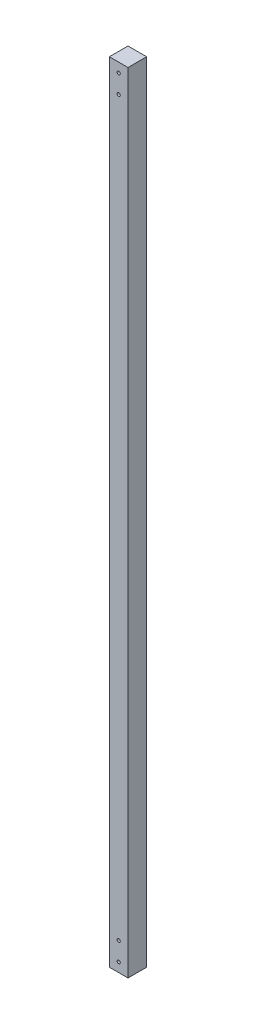
ISO-10303-21;
HEADER;
FILE_DESCRIPTION(('STEP AP214'),'2;1');
FILE_NAME('part.step','',(''),(''),'','','');
FILE_SCHEMA(('AUTOMOTIVE_DESIGN { 1 0 10303 214 1 1 1 1 }'));
ENDSEC;
DATA;
#1=APPLICATION_CONTEXT('core data for automotive mechanical design processes');
#2=APPLICATION_PROTOCOL_DEFINITION('international standard','automotive_design',2000,#1);
#3=PRODUCT_CONTEXT('',#1,'mechanical');
#4=PRODUCT('Part','Part','',(#3));
#5=PRODUCT_RELATED_PRODUCT_CATEGORY('part','',(#4));
#6=PRODUCT_DEFINITION_FORMATION('','',#4);
#7=PRODUCT_DEFINITION_CONTEXT('part definition',#1,'design');
#8=PRODUCT_DEFINITION('design','',#6,#7);
#9=PRODUCT_DEFINITION_SHAPE('','',#8);
#10=(LENGTH_UNIT() NAMED_UNIT(*) SI_UNIT(.MILLI.,.METRE.));
#11=(NAMED_UNIT(*) PLANE_ANGLE_UNIT() SI_UNIT($,.RADIAN.));
#12=(NAMED_UNIT(*) SI_UNIT($,.STERADIAN.) SOLID_ANGLE_UNIT());
#13=UNCERTAINTY_MEASURE_WITH_UNIT(LENGTH_MEASURE(1.E-05),#10,'distance_accuracy_value','');
#14=(GEOMETRIC_REPRESENTATION_CONTEXT(3) GLOBAL_UNCERTAINTY_ASSIGNED_CONTEXT((#13)) GLOBAL_UNIT_ASSIGNED_CONTEXT((#10,
#11,#12)) REPRESENTATION_CONTEXT('',''));
#15=CARTESIAN_POINT('',(0.,0.,0.));
#16=DIRECTION('',(0.,0.,1.));
#17=DIRECTION('',(1.,0.,0.));
#18=AXIS2_PLACEMENT_3D('',#15,#16,#17);
#19=CARTESIAN_POINT('',(0.,846.5,0.));
#20=DIRECTION('',(1.,0.,0.));
#21=DIRECTION('',(0.,0.,-1.));
#22=AXIS2_PLACEMENT_3D('',#19,#20,#21);
#23=PLANE('',#22);
#24=DIRECTION('',(0.,0.,1.));
#25=VECTOR('',#24,1.);
#26=CARTESIAN_POINT('',(0.,0.,0.));
#27=LINE('',#26,#25);
#28=CARTESIAN_POINT('',(0.,0.,-20.));
#29=VERTEX_POINT('',#28);
#30=CARTESIAN_POINT('',(0.,0.,0.));
#31=VERTEX_POINT('',#30);
#32=EDGE_CURVE('E120',#29,#31,#27,.T.);
#33=ORIENTED_EDGE('',*,*,#32,.T.);
#34=DIRECTION('',(0.,-1.,0.));
#35=VECTOR('',#34,1.);
#36=CARTESIAN_POINT('',(0.,846.5,0.));
#37=LINE('',#36,#35);
#38=CARTESIAN_POINT('',(0.,846.5,0.));
#39=VERTEX_POINT('',#38);
#40=EDGE_CURVE('E12',#39,#31,#37,.T.);
#41=ORIENTED_EDGE('',*,*,#40,.F.);
#42=DIRECTION('',(0.,0.,1.));
#43=VECTOR('',#42,1.);
#44=CARTESIAN_POINT('',(0.,846.5,0.));
#45=LINE('',#44,#43);
#46=CARTESIAN_POINT('',(0.,846.5,-20.));
#47=VERTEX_POINT('',#46);
#48=EDGE_CURVE('E99',#47,#39,#45,.T.);
#49=ORIENTED_EDGE('',*,*,#48,.F.);
#50=DIRECTION('',(0.,-1.,0.));
#51=VECTOR('',#50,1.);
#52=CARTESIAN_POINT('',(0.,846.5,-20.));
#53=LINE('',#52,#51);
#54=EDGE_CURVE('E115',#47,#29,#53,.T.);
#55=ORIENTED_EDGE('',*,*,#54,.T.);
#56=EDGE_LOOP('',(#33,#41,#49,#55));
#57=FACE_BOUND('',#56,.T.);
#58=ADVANCED_FACE('F50',(#57),#23,.F.);
#59=CARTESIAN_POINT('',(0.,846.5,0.));
#60=DIRECTION('',(0.,0.,-1.));
#61=DIRECTION('',(-1.,0.,0.));
#62=AXIS2_PLACEMENT_3D('',#59,#60,#61);
#63=PLANE('',#62);
#64=CARTESIAN_POINT('',(10.,10.,0.));
#65=DIRECTION('',(0.,0.,1.));
#66=DIRECTION('',(1.,0.,0.));
#67=AXIS2_PLACEMENT_3D('',#64,#65,#66);
#68=CIRCLE('',#67,1.7);
#69=CARTESIAN_POINT('',(11.7,10.,0.));
#70=VERTEX_POINT('',#69);
#71=EDGE_CURVE('E142',#70,#70,#68,.T.);
#72=ORIENTED_EDGE('',*,*,#71,.F.);
#73=EDGE_LOOP('',(#72));
#74=FACE_BOUND('',#73,.T.);
#75=CARTESIAN_POINT('',(10.,816.5,0.));
#76=DIRECTION('',(0.,0.,1.));
#77=DIRECTION('',(1.,0.,0.));
#78=AXIS2_PLACEMENT_3D('',#75,#76,#77);
#79=CIRCLE('',#78,1.69999999999999);
#80=CARTESIAN_POINT('',(11.7,816.5,0.));
#81=VERTEX_POINT('',#80);
#82=EDGE_CURVE('E161',#81,#81,#79,.T.);
#83=ORIENTED_EDGE('',*,*,#82,.F.);
#84=EDGE_LOOP('',(#83));
#85=FACE_BOUND('',#84,.T.);
#86=CARTESIAN_POINT('',(10.,836.5,0.));
#87=DIRECTION('',(0.,0.,1.));
#88=DIRECTION('',(1.,0.,0.));
#89=AXIS2_PLACEMENT_3D('',#86,#87,#88);
#90=CIRCLE('',#89,1.69999999999999);
#91=CARTESIAN_POINT('',(11.7,836.5,0.));
#92=VERTEX_POINT('',#91);
#93=EDGE_CURVE('E153',#92,#92,#90,.T.);
#94=ORIENTED_EDGE('',*,*,#93,.F.);
#95=EDGE_LOOP('',(#94));
#96=FACE_BOUND('',#95,.T.);
#97=CARTESIAN_POINT('',(10.,30.,0.));
#98=DIRECTION('',(0.,0.,1.));
#99=DIRECTION('',(1.,0.,0.));
#100=AXIS2_PLACEMENT_3D('',#97,#98,#99);
#101=CIRCLE('',#100,1.7);
#102=CARTESIAN_POINT('',(11.7,30.,0.));
#103=VERTEX_POINT('',#102);
#104=EDGE_CURVE('E148',#103,#103,#101,.T.);
#105=ORIENTED_EDGE('',*,*,#104,.F.);
#106=EDGE_LOOP('',(#105));
#107=FACE_BOUND('',#106,.T.);
#108=DIRECTION('',(1.,0.,0.));
#109=VECTOR('',#108,1.);
#110=CARTESIAN_POINT('',(0.,0.,0.));
#111=LINE('',#110,#109);
#112=CARTESIAN_POINT('',(20.,0.,0.));
#113=VERTEX_POINT('',#112);
#114=EDGE_CURVE('E104',#31,#113,#111,.T.);
#115=ORIENTED_EDGE('',*,*,#114,.T.);
#116=DIRECTION('',(0.,-1.,0.));
#117=VECTOR('',#116,1.);
#118=CARTESIAN_POINT('',(20.,846.5,0.));
#119=LINE('',#118,#117);
#120=CARTESIAN_POINT('',(20.,846.5,0.));
#121=VERTEX_POINT('',#120);
#122=EDGE_CURVE('E60',#121,#113,#119,.T.);
#123=ORIENTED_EDGE('',*,*,#122,.F.);
#124=DIRECTION('',(1.,0.,0.));
#125=VECTOR('',#124,1.);
#126=CARTESIAN_POINT('',(0.,846.5,0.));
#127=LINE('',#126,#125);
#128=EDGE_CURVE('E92',#39,#121,#127,.T.);
#129=ORIENTED_EDGE('',*,*,#128,.F.);
#130=ORIENTED_EDGE('',*,*,#40,.T.);
#131=EDGE_LOOP('',(#115,#123,#129,#130));
#132=FACE_BOUND('',#131,.T.);
#133=ADVANCED_FACE('F102',(#74,#85,#96,#107,#132),#63,.F.);
#134=CARTESIAN_POINT('',(20.,846.5,0.));
#135=DIRECTION('',(-1.,0.,0.));
#136=DIRECTION('',(0.,0.,1.));
#137=AXIS2_PLACEMENT_3D('',#134,#135,#136);
#138=PLANE('',#137);
#139=DIRECTION('',(0.,0.,-1.));
#140=VECTOR('',#139,1.);
#141=CARTESIAN_POINT('',(20.,0.,0.));
#142=LINE('',#141,#140);
#143=CARTESIAN_POINT('',(20.,0.,-20.));
#144=VERTEX_POINT('',#143);
#145=EDGE_CURVE('E85',#113,#144,#142,.T.);
#146=ORIENTED_EDGE('',*,*,#145,.T.);
#147=DIRECTION('',(0.,-1.,0.));
#148=VECTOR('',#147,1.);
#149=CARTESIAN_POINT('',(20.,846.5,-20.));
#150=LINE('',#149,#148);
#151=CARTESIAN_POINT('',(20.,846.5,-20.));
#152=VERTEX_POINT('',#151);
#153=EDGE_CURVE('E110',#152,#144,#150,.T.);
#154=ORIENTED_EDGE('',*,*,#153,.F.);
#155=DIRECTION('',(0.,0.,-1.));
#156=VECTOR('',#155,1.);
#157=CARTESIAN_POINT('',(20.,846.5,0.));
#158=LINE('',#157,#156);
#159=EDGE_CURVE('E98',#121,#152,#158,.T.);
#160=ORIENTED_EDGE('',*,*,#159,.F.);
#161=ORIENTED_EDGE('',*,*,#122,.T.);
#162=EDGE_LOOP('',(#146,#154,#160,#161));
#163=FACE_BOUND('',#162,.T.);
#164=ADVANCED_FACE('F107',(#163),#138,.F.);
#165=CARTESIAN_POINT('',(0.,846.5,-20.));
#166=DIRECTION('',(0.,0.,1.));
#167=DIRECTION('',(1.,0.,0.));
#168=AXIS2_PLACEMENT_3D('',#165,#166,#167);
#169=PLANE('',#168);
#170=CARTESIAN_POINT('',(10.,10.,-20.));
#171=DIRECTION('',(0.,0.,1.));
#172=DIRECTION('',(1.,0.,0.));
#173=AXIS2_PLACEMENT_3D('',#170,#171,#172);
#174=CIRCLE('',#173,1.7);
#175=CARTESIAN_POINT('',(11.7,10.,-20.));
#176=VERTEX_POINT('',#175);
#177=EDGE_CURVE('E122',#176,#176,#174,.T.);
#178=ORIENTED_EDGE('',*,*,#177,.T.);
#179=EDGE_LOOP('',(#178));
#180=FACE_BOUND('',#179,.T.);
#181=CARTESIAN_POINT('',(10.,816.5,-20.));
#182=DIRECTION('',(0.,0.,1.));
#183=DIRECTION('',(1.,0.,0.));
#184=AXIS2_PLACEMENT_3D('',#181,#182,#183);
#185=CIRCLE('',#184,1.69999999999999);
#186=CARTESIAN_POINT('',(11.7,816.5,-20.));
#187=VERTEX_POINT('',#186);
#188=EDGE_CURVE('E164',#187,#187,#185,.T.);
#189=ORIENTED_EDGE('',*,*,#188,.T.);
#190=EDGE_LOOP('',(#189));
#191=FACE_BOUND('',#190,.T.);
#192=CARTESIAN_POINT('',(10.,836.5,-20.));
#193=DIRECTION('',(0.,0.,1.));
#194=DIRECTION('',(1.,0.,0.));
#195=AXIS2_PLACEMENT_3D('',#192,#193,#194);
#196=CIRCLE('',#195,1.69999999999999);
#197=CARTESIAN_POINT('',(11.7,836.5,-20.));
#198=VERTEX_POINT('',#197);
#199=EDGE_CURVE('E160',#198,#198,#196,.T.);
#200=ORIENTED_EDGE('',*,*,#199,.T.);
#201=EDGE_LOOP('',(#200));
#202=FACE_BOUND('',#201,.T.);
#203=CARTESIAN_POINT('',(10.,30.,-20.));
#204=DIRECTION('',(0.,0.,1.));
#205=DIRECTION('',(1.,0.,0.));
#206=AXIS2_PLACEMENT_3D('',#203,#204,#205);
#207=CIRCLE('',#206,1.7);
#208=CARTESIAN_POINT('',(11.7,30.,-20.));
#209=VERTEX_POINT('',#208);
#210=EDGE_CURVE('E147',#209,#209,#207,.T.);
#211=ORIENTED_EDGE('',*,*,#210,.T.);
#212=EDGE_LOOP('',(#211));
#213=FACE_BOUND('',#212,.T.);
#214=DIRECTION('',(-1.,0.,0.));
#215=VECTOR('',#214,1.);
#216=CARTESIAN_POINT('',(0.,0.,-20.));
#217=LINE('',#216,#215);
#218=EDGE_CURVE('E86',#144,#29,#217,.T.);
#219=ORIENTED_EDGE('',*,*,#218,.T.);
#220=ORIENTED_EDGE('',*,*,#54,.F.);
#221=DIRECTION('',(-1.,0.,0.));
#222=VECTOR('',#221,1.);
#223=CARTESIAN_POINT('',(0.,846.5,-20.));
#224=LINE('',#223,#222);
#225=EDGE_CURVE('E64',#152,#47,#224,.T.);
#226=ORIENTED_EDGE('',*,*,#225,.F.);
#227=ORIENTED_EDGE('',*,*,#153,.T.);
#228=EDGE_LOOP('',(#219,#220,#226,#227));
#229=FACE_BOUND('',#228,.T.);
#230=ADVANCED_FACE('F180',(#180,#191,#202,#213,#229),#169,.F.);
#231=CARTESIAN_POINT('',(0.,846.5,0.));
#232=DIRECTION('',(0.,-1.,0.));
#233=DIRECTION('',(0.,0.,-1.));
#234=AXIS2_PLACEMENT_3D('',#231,#232,#233);
#235=PLANE('',#234);
#236=ORIENTED_EDGE('',*,*,#48,.T.);
#237=ORIENTED_EDGE('',*,*,#128,.T.);
#238=ORIENTED_EDGE('',*,*,#159,.T.);
#239=ORIENTED_EDGE('',*,*,#225,.T.);
#240=EDGE_LOOP('',(#236,#237,#238,#239));
#241=FACE_BOUND('',#240,.T.);
#242=ADVANCED_FACE('F96',(#241),#235,.F.);
#243=CARTESIAN_POINT('',(0.,0.,0.));
#244=DIRECTION('',(0.,-1.,0.));
#245=DIRECTION('',(0.,0.,-1.));
#246=AXIS2_PLACEMENT_3D('',#243,#244,#245);
#247=PLANE('',#246);
#248=ORIENTED_EDGE('',*,*,#32,.F.);
#249=ORIENTED_EDGE('',*,*,#218,.F.);
#250=ORIENTED_EDGE('',*,*,#145,.F.);
#251=ORIENTED_EDGE('',*,*,#114,.F.);
#252=EDGE_LOOP('',(#248,#249,#250,#251));
#253=FACE_BOUND('',#252,.T.);
#254=ADVANCED_FACE('F197',(#253),#247,.T.);
#255=CARTESIAN_POINT('',(10.,30.,-20.));
#256=DIRECTION('',(0.,0.,1.));
#257=DIRECTION('',(1.,0.,0.));
#258=AXIS2_PLACEMENT_3D('',#255,#256,#257);
#259=CYLINDRICAL_SURFACE('',#258,1.7);
#260=ORIENTED_EDGE('',*,*,#210,.F.);
#261=EDGE_LOOP('',(#260));
#262=FACE_BOUND('',#261,.T.);
#263=ORIENTED_EDGE('',*,*,#104,.T.);
#264=EDGE_LOOP('',(#263));
#265=FACE_BOUND('',#264,.T.);
#266=ADVANCED_FACE('F191',(#262,#265),#259,.F.);
#267=CARTESIAN_POINT('',(10.,836.5,-20.));
#268=DIRECTION('',(0.,0.,1.));
#269=DIRECTION('',(1.,0.,0.));
#270=AXIS2_PLACEMENT_3D('',#267,#268,#269);
#271=CYLINDRICAL_SURFACE('',#270,1.69999999999999);
#272=ORIENTED_EDGE('',*,*,#199,.F.);
#273=EDGE_LOOP('',(#272));
#274=FACE_BOUND('',#273,.T.);
#275=ORIENTED_EDGE('',*,*,#93,.T.);
#276=EDGE_LOOP('',(#275));
#277=FACE_BOUND('',#276,.T.);
#278=ADVANCED_FACE('F184',(#274,#277),#271,.F.);
#279=CARTESIAN_POINT('',(10.,816.5,-20.));
#280=DIRECTION('',(0.,0.,1.));
#281=DIRECTION('',(1.,0.,0.));
#282=AXIS2_PLACEMENT_3D('',#279,#280,#281);
#283=CYLINDRICAL_SURFACE('',#282,1.69999999999999);
#284=ORIENTED_EDGE('',*,*,#188,.F.);
#285=EDGE_LOOP('',(#284));
#286=FACE_BOUND('',#285,.T.);
#287=ORIENTED_EDGE('',*,*,#82,.T.);
#288=EDGE_LOOP('',(#287));
#289=FACE_BOUND('',#288,.T.);
#290=ADVANCED_FACE('F176',(#286,#289),#283,.F.);
#291=CARTESIAN_POINT('',(10.,10.,-20.));
#292=DIRECTION('',(0.,0.,1.));
#293=DIRECTION('',(1.,0.,0.));
#294=AXIS2_PLACEMENT_3D('',#291,#292,#293);
#295=CYLINDRICAL_SURFACE('',#294,1.7);
#296=ORIENTED_EDGE('',*,*,#177,.F.);
#297=EDGE_LOOP('',(#296));
#298=FACE_BOUND('',#297,.T.);
#299=ORIENTED_EDGE('',*,*,#71,.T.);
#300=EDGE_LOOP('',(#299));
#301=FACE_BOUND('',#300,.T.);
#302=ADVANCED_FACE('F181',(#298,#301),#295,.F.);
#303=CLOSED_SHELL('',(#58,#133,#164,#230,#242,#254,#266,#278,#290,#302));
#304=MANIFOLD_SOLID_BREP('B2',#303);
#305=ADVANCED_BREP_SHAPE_REPRESENTATION('',(#18,#304),#14);
#306=SHAPE_DEFINITION_REPRESENTATION(#9,#305);
ENDSEC;
END-ISO-10303-21;
